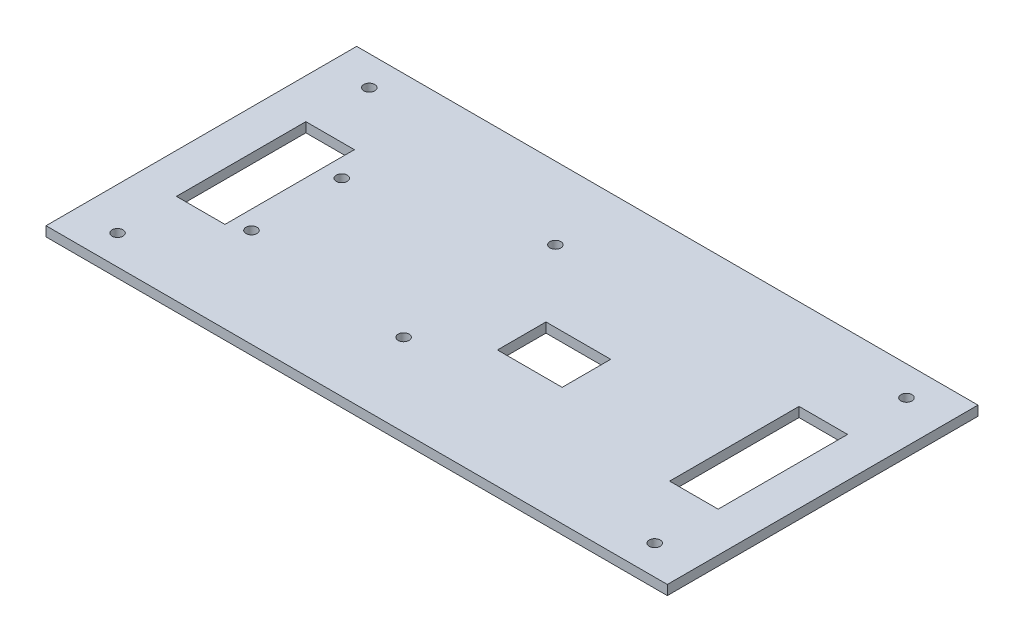
ISO-10303-21;
HEADER;
FILE_DESCRIPTION(('STEP AP214'),'2;1');
FILE_NAME('part.step','',(''),(''),'','','');
FILE_SCHEMA(('AUTOMOTIVE_DESIGN { 1 0 10303 214 1 1 1 1 }'));
ENDSEC;
DATA;
#1=APPLICATION_CONTEXT('core data for automotive mechanical design processes');
#2=APPLICATION_PROTOCOL_DEFINITION('international standard','automotive_design',2000,#1);
#3=PRODUCT_CONTEXT('',#1,'mechanical');
#4=PRODUCT('Part','Part','',(#3));
#5=PRODUCT_RELATED_PRODUCT_CATEGORY('part','',(#4));
#6=PRODUCT_DEFINITION_FORMATION('','',#4);
#7=PRODUCT_DEFINITION_CONTEXT('part definition',#1,'design');
#8=PRODUCT_DEFINITION('design','',#6,#7);
#9=PRODUCT_DEFINITION_SHAPE('','',#8);
#10=(LENGTH_UNIT() NAMED_UNIT(*) SI_UNIT(.MILLI.,.METRE.));
#11=(NAMED_UNIT(*) PLANE_ANGLE_UNIT() SI_UNIT($,.RADIAN.));
#12=(NAMED_UNIT(*) SI_UNIT($,.STERADIAN.) SOLID_ANGLE_UNIT());
#13=UNCERTAINTY_MEASURE_WITH_UNIT(LENGTH_MEASURE(1.E-05),#10,'distance_accuracy_value','');
#14=(GEOMETRIC_REPRESENTATION_CONTEXT(3) GLOBAL_UNCERTAINTY_ASSIGNED_CONTEXT((#13)) GLOBAL_UNIT_ASSIGNED_CONTEXT((#10,
#11,#12)) REPRESENTATION_CONTEXT('',''));
#15=CARTESIAN_POINT('',(0.,0.,0.));
#16=DIRECTION('',(0.,0.,1.));
#17=DIRECTION('',(1.,0.,0.));
#18=AXIS2_PLACEMENT_3D('',#15,#16,#17);
#19=CARTESIAN_POINT('',(0.,3.,0.));
#20=DIRECTION('',(1.,0.,0.));
#21=DIRECTION('',(0.,0.,-1.));
#22=AXIS2_PLACEMENT_3D('',#19,#20,#21);
#23=PLANE('',#22);
#24=DIRECTION('',(0.,0.,1.));
#25=VECTOR('',#24,1.);
#26=CARTESIAN_POINT('',(0.,0.,0.));
#27=LINE('',#26,#25);
#28=CARTESIAN_POINT('',(0.,0.,-96.));
#29=VERTEX_POINT('',#28);
#30=CARTESIAN_POINT('',(0.,0.,0.));
#31=VERTEX_POINT('',#30);
#32=EDGE_CURVE('E276',#29,#31,#27,.T.);
#33=ORIENTED_EDGE('',*,*,#32,.T.);
#34=DIRECTION('',(0.,-1.,0.));
#35=VECTOR('',#34,1.);
#36=CARTESIAN_POINT('',(0.,3.,0.));
#37=LINE('',#36,#35);
#38=CARTESIAN_POINT('',(0.,3.,0.));
#39=VERTEX_POINT('',#38);
#40=EDGE_CURVE('E11',#39,#31,#37,.T.);
#41=ORIENTED_EDGE('',*,*,#40,.F.);
#42=DIRECTION('',(0.,0.,1.));
#43=VECTOR('',#42,1.);
#44=CARTESIAN_POINT('',(0.,3.,0.));
#45=LINE('',#44,#43);
#46=CARTESIAN_POINT('',(0.,3.,-96.));
#47=VERTEX_POINT('',#46);
#48=EDGE_CURVE('E277',#47,#39,#45,.T.);
#49=ORIENTED_EDGE('',*,*,#48,.F.);
#50=DIRECTION('',(0.,-1.,0.));
#51=VECTOR('',#50,1.);
#52=CARTESIAN_POINT('',(0.,3.,-96.));
#53=LINE('',#52,#51);
#54=EDGE_CURVE('E287',#47,#29,#53,.T.);
#55=ORIENTED_EDGE('',*,*,#54,.T.);
#56=EDGE_LOOP('',(#33,#41,#49,#55));
#57=FACE_BOUND('',#56,.T.);
#58=ADVANCED_FACE('F35',(#57),#23,.F.);
#59=CARTESIAN_POINT('',(0.,3.,0.));
#60=DIRECTION('',(0.,0.,-1.));
#61=DIRECTION('',(-1.,0.,0.));
#62=AXIS2_PLACEMENT_3D('',#59,#60,#61);
#63=PLANE('',#62);
#64=DIRECTION('',(1.,0.,0.));
#65=VECTOR('',#64,1.);
#66=CARTESIAN_POINT('',(0.,0.,0.));
#67=LINE('',#66,#65);
#68=CARTESIAN_POINT('',(192.,0.,0.));
#69=VERTEX_POINT('',#68);
#70=EDGE_CURVE('E290',#31,#69,#67,.T.);
#71=ORIENTED_EDGE('',*,*,#70,.T.);
#72=DIRECTION('',(0.,-1.,0.));
#73=VECTOR('',#72,1.);
#74=CARTESIAN_POINT('',(192.,3.,0.));
#75=LINE('',#74,#73);
#76=CARTESIAN_POINT('',(192.,3.,0.));
#77=VERTEX_POINT('',#76);
#78=EDGE_CURVE('E42',#77,#69,#75,.T.);
#79=ORIENTED_EDGE('',*,*,#78,.F.);
#80=DIRECTION('',(1.,0.,0.));
#81=VECTOR('',#80,1.);
#82=CARTESIAN_POINT('',(0.,3.,0.));
#83=LINE('',#82,#81);
#84=EDGE_CURVE('E280',#39,#77,#83,.T.);
#85=ORIENTED_EDGE('',*,*,#84,.F.);
#86=ORIENTED_EDGE('',*,*,#40,.T.);
#87=EDGE_LOOP('',(#71,#79,#85,#86));
#88=FACE_BOUND('',#87,.T.);
#89=ADVANCED_FACE('F319',(#88),#63,.F.);
#90=CARTESIAN_POINT('',(192.,3.,0.));
#91=DIRECTION('',(-1.,0.,0.));
#92=DIRECTION('',(0.,0.,1.));
#93=AXIS2_PLACEMENT_3D('',#90,#91,#92);
#94=PLANE('',#93);
#95=DIRECTION('',(0.,0.,-1.));
#96=VECTOR('',#95,1.);
#97=CARTESIAN_POINT('',(192.,0.,0.));
#98=LINE('',#97,#96);
#99=CARTESIAN_POINT('',(192.,0.,-96.));
#100=VERTEX_POINT('',#99);
#101=EDGE_CURVE('E292',#69,#100,#98,.T.);
#102=ORIENTED_EDGE('',*,*,#101,.T.);
#103=DIRECTION('',(0.,-1.,0.));
#104=VECTOR('',#103,1.);
#105=CARTESIAN_POINT('',(192.,3.,-96.));
#106=LINE('',#105,#104);
#107=CARTESIAN_POINT('',(192.,3.,-96.));
#108=VERTEX_POINT('',#107);
#109=EDGE_CURVE('E297',#108,#100,#106,.T.);
#110=ORIENTED_EDGE('',*,*,#109,.F.);
#111=DIRECTION('',(0.,0.,-1.));
#112=VECTOR('',#111,1.);
#113=CARTESIAN_POINT('',(192.,3.,0.));
#114=LINE('',#113,#112);
#115=EDGE_CURVE('E283',#77,#108,#114,.T.);
#116=ORIENTED_EDGE('',*,*,#115,.F.);
#117=ORIENTED_EDGE('',*,*,#78,.T.);
#118=EDGE_LOOP('',(#102,#110,#116,#117));
#119=FACE_BOUND('',#118,.T.);
#120=ADVANCED_FACE('F304',(#119),#94,.F.);
#121=CARTESIAN_POINT('',(0.,3.,-96.));
#122=DIRECTION('',(0.,0.,1.));
#123=DIRECTION('',(1.,0.,0.));
#124=AXIS2_PLACEMENT_3D('',#121,#122,#123);
#125=PLANE('',#124);
#126=DIRECTION('',(-1.,0.,0.));
#127=VECTOR('',#126,1.);
#128=CARTESIAN_POINT('',(0.,0.,-96.));
#129=LINE('',#128,#127);
#130=EDGE_CURVE('E281',#100,#29,#129,.T.);
#131=ORIENTED_EDGE('',*,*,#130,.T.);
#132=ORIENTED_EDGE('',*,*,#54,.F.);
#133=DIRECTION('',(-1.,0.,0.));
#134=VECTOR('',#133,1.);
#135=CARTESIAN_POINT('',(0.,3.,-96.));
#136=LINE('',#135,#134);
#137=EDGE_CURVE('E285',#108,#47,#136,.T.);
#138=ORIENTED_EDGE('',*,*,#137,.F.);
#139=ORIENTED_EDGE('',*,*,#109,.T.);
#140=EDGE_LOOP('',(#131,#132,#138,#139));
#141=FACE_BOUND('',#140,.T.);
#142=ADVANCED_FACE('F313',(#141),#125,.F.);
#143=CARTESIAN_POINT('',(0.,3.,0.));
#144=DIRECTION('',(0.,-1.,0.));
#145=DIRECTION('',(0.,0.,-1.));
#146=AXIS2_PLACEMENT_3D('',#143,#144,#145);
#147=PLANE('',#146);
#148=CARTESIAN_POINT('',(33.,3.,-58.4));
#149=DIRECTION('',(0.,-1.,0.));
#150=DIRECTION('',(0.,0.,-1.));
#151=AXIS2_PLACEMENT_3D('',#148,#149,#150);
#152=CIRCLE('',#151,1.7);
#153=CARTESIAN_POINT('',(33.,3.,-60.1));
#154=VERTEX_POINT('',#153);
#155=EDGE_CURVE('E413',#154,#154,#152,.T.);
#156=ORIENTED_EDGE('',*,*,#155,.T.);
#157=EDGE_LOOP('',(#156));
#158=FACE_BOUND('',#157,.T.);
#159=CARTESIAN_POINT('',(33.,3.,-30.5));
#160=DIRECTION('',(0.,-1.,0.));
#161=DIRECTION('',(0.,0.,-1.));
#162=AXIS2_PLACEMENT_3D('',#159,#160,#161);
#163=CIRCLE('',#162,1.7);
#164=CARTESIAN_POINT('',(33.,3.,-32.2));
#165=VERTEX_POINT('',#164);
#166=EDGE_CURVE('E423',#165,#165,#163,.T.);
#167=ORIENTED_EDGE('',*,*,#166,.T.);
#168=EDGE_LOOP('',(#167));
#169=FACE_BOUND('',#168,.T.);
#170=CARTESIAN_POINT('',(85.11,3.,-25.4));
#171=DIRECTION('',(0.,-1.,0.));
#172=DIRECTION('',(0.,0.,-1.));
#173=AXIS2_PLACEMENT_3D('',#170,#171,#172);
#174=CIRCLE('',#173,1.69999999999999);
#175=CARTESIAN_POINT('',(85.11,3.,-27.1));
#176=VERTEX_POINT('',#175);
#177=EDGE_CURVE('E429',#176,#176,#174,.T.);
#178=ORIENTED_EDGE('',*,*,#177,.T.);
#179=EDGE_LOOP('',(#178));
#180=FACE_BOUND('',#179,.T.);
#181=CARTESIAN_POINT('',(83.8,3.,-73.6));
#182=DIRECTION('',(0.,-1.,0.));
#183=DIRECTION('',(0.,0.,-1.));
#184=AXIS2_PLACEMENT_3D('',#181,#182,#183);
#185=CIRCLE('',#184,1.69999999999999);
#186=CARTESIAN_POINT('',(83.8,3.,-75.3));
#187=VERTEX_POINT('',#186);
#188=EDGE_CURVE('E175',#187,#187,#185,.T.);
#189=ORIENTED_EDGE('',*,*,#188,.T.);
#190=EDGE_LOOP('',(#189));
#191=FACE_BOUND('',#190,.T.);
#192=DIRECTION('',(1.,0.,0.));
#193=VECTOR('',#192,1.);
#194=CARTESIAN_POINT('',(179.7,3.,-68.0000000000001));
#195=LINE('',#194,#193);
#196=CARTESIAN_POINT('',(164.7,3.,-68.0000000000001));
#197=VERTEX_POINT('',#196);
#198=CARTESIAN_POINT('',(179.7,3.,-68.0000000000001));
#199=VERTEX_POINT('',#198);
#200=EDGE_CURVE('E159',#197,#199,#195,.T.);
#201=ORIENTED_EDGE('',*,*,#200,.T.);
#202=DIRECTION('',(0.,0.,1.));
#203=VECTOR('',#202,1.);
#204=CARTESIAN_POINT('',(179.7,3.,-28.));
#205=LINE('',#204,#203);
#206=CARTESIAN_POINT('',(179.7,3.,-28.));
#207=VERTEX_POINT('',#206);
#208=EDGE_CURVE('E151',#199,#207,#205,.T.);
#209=ORIENTED_EDGE('',*,*,#208,.T.);
#210=DIRECTION('',(-1.,0.,0.));
#211=VECTOR('',#210,1.);
#212=CARTESIAN_POINT('',(179.7,3.,-28.));
#213=LINE('',#212,#211);
#214=CARTESIAN_POINT('',(164.7,3.,-28.));
#215=VERTEX_POINT('',#214);
#216=EDGE_CURVE('E162',#207,#215,#213,.T.);
#217=ORIENTED_EDGE('',*,*,#216,.T.);
#218=DIRECTION('',(0.,0.,-1.));
#219=VECTOR('',#218,1.);
#220=CARTESIAN_POINT('',(164.7,3.,-28.));
#221=LINE('',#220,#219);
#222=EDGE_CURVE('E49',#215,#197,#221,.T.);
#223=ORIENTED_EDGE('',*,*,#222,.T.);
#224=EDGE_LOOP('',(#201,#209,#217,#223));
#225=FACE_BOUND('',#224,.T.);
#226=DIRECTION('',(-1.,0.,0.));
#227=VECTOR('',#226,1.);
#228=CARTESIAN_POINT('',(103.,3.,-36.5));
#229=LINE('',#228,#227);
#230=CARTESIAN_POINT('',(123.,3.,-36.5));
#231=VERTEX_POINT('',#230);
#232=CARTESIAN_POINT('',(103.,3.,-36.5));
#233=VERTEX_POINT('',#232);
#234=EDGE_CURVE('E200',#231,#233,#229,.T.);
#235=ORIENTED_EDGE('',*,*,#234,.T.);
#236=DIRECTION('',(0.,0.,-1.));
#237=VECTOR('',#236,1.);
#238=CARTESIAN_POINT('',(103.,3.,-36.5));
#239=LINE('',#238,#237);
#240=CARTESIAN_POINT('',(103.,3.,-51.5));
#241=VERTEX_POINT('',#240);
#242=EDGE_CURVE('E192',#233,#241,#239,.T.);
#243=ORIENTED_EDGE('',*,*,#242,.T.);
#244=DIRECTION('',(1.,0.,0.));
#245=VECTOR('',#244,1.);
#246=CARTESIAN_POINT('',(103.,3.,-51.5));
#247=LINE('',#246,#245);
#248=CARTESIAN_POINT('',(123.,3.,-51.5));
#249=VERTEX_POINT('',#248);
#250=EDGE_CURVE('E195',#241,#249,#247,.T.);
#251=ORIENTED_EDGE('',*,*,#250,.T.);
#252=DIRECTION('',(0.,0.,1.));
#253=VECTOR('',#252,1.);
#254=CARTESIAN_POINT('',(123.,3.,-36.5));
#255=LINE('',#254,#253);
#256=EDGE_CURVE('E57',#249,#231,#255,.T.);
#257=ORIENTED_EDGE('',*,*,#256,.T.);
#258=EDGE_LOOP('',(#235,#243,#251,#257));
#259=FACE_BOUND('',#258,.T.);
#260=DIRECTION('',(-1.,0.,0.));
#261=VECTOR('',#260,1.);
#262=CARTESIAN_POINT('',(12.3,3.,-28.));
#263=LINE('',#262,#261);
#264=CARTESIAN_POINT('',(27.3,3.,-28.));
#265=VERTEX_POINT('',#264);
#266=CARTESIAN_POINT('',(12.3,3.,-28.));
#267=VERTEX_POINT('',#266);
#268=EDGE_CURVE('E231',#265,#267,#263,.T.);
#269=ORIENTED_EDGE('',*,*,#268,.T.);
#270=DIRECTION('',(0.,0.,-1.));
#271=VECTOR('',#270,1.);
#272=CARTESIAN_POINT('',(12.3,3.,-28.));
#273=LINE('',#272,#271);
#274=CARTESIAN_POINT('',(12.3,3.,-68.));
#275=VERTEX_POINT('',#274);
#276=EDGE_CURVE('E221',#267,#275,#273,.T.);
#277=ORIENTED_EDGE('',*,*,#276,.T.);
#278=DIRECTION('',(1.,0.,0.));
#279=VECTOR('',#278,1.);
#280=CARTESIAN_POINT('',(12.3,3.,-68.));
#281=LINE('',#280,#279);
#282=CARTESIAN_POINT('',(27.3,3.,-68.));
#283=VERTEX_POINT('',#282);
#284=EDGE_CURVE('E224',#275,#283,#281,.T.);
#285=ORIENTED_EDGE('',*,*,#284,.T.);
#286=DIRECTION('',(0.,0.,1.));
#287=VECTOR('',#286,1.);
#288=CARTESIAN_POINT('',(27.3,3.,-28.));
#289=LINE('',#288,#287);
#290=EDGE_CURVE('E228',#283,#265,#289,.T.);
#291=ORIENTED_EDGE('',*,*,#290,.T.);
#292=EDGE_LOOP('',(#269,#277,#285,#291));
#293=FACE_BOUND('',#292,.T.);
#294=CARTESIAN_POINT('',(13.,3.,-9.1));
#295=DIRECTION('',(0.,-1.,0.));
#296=DIRECTION('',(0.,0.,-1.));
#297=AXIS2_PLACEMENT_3D('',#294,#295,#296);
#298=CIRCLE('',#297,1.7);
#299=CARTESIAN_POINT('',(13.,3.,-10.8));
#300=VERTEX_POINT('',#299);
#301=EDGE_CURVE('E255',#300,#300,#298,.T.);
#302=ORIENTED_EDGE('',*,*,#301,.T.);
#303=EDGE_LOOP('',(#302));
#304=FACE_BOUND('',#303,.T.);
#305=CARTESIAN_POINT('',(179.,3.,-9.1));
#306=DIRECTION('',(0.,-1.,0.));
#307=DIRECTION('',(0.,0.,-1.));
#308=AXIS2_PLACEMENT_3D('',#305,#306,#307);
#309=CIRCLE('',#308,1.70000000000001);
#310=CARTESIAN_POINT('',(179.,3.,-10.8));
#311=VERTEX_POINT('',#310);
#312=EDGE_CURVE('E261',#311,#311,#309,.T.);
#313=ORIENTED_EDGE('',*,*,#312,.T.);
#314=EDGE_LOOP('',(#313));
#315=FACE_BOUND('',#314,.T.);
#316=CARTESIAN_POINT('',(179.,3.,-86.9));
#317=DIRECTION('',(0.,-1.,0.));
#318=DIRECTION('',(0.,0.,-1.));
#319=AXIS2_PLACEMENT_3D('',#316,#317,#318);
#320=CIRCLE('',#319,1.70000000000001);
#321=CARTESIAN_POINT('',(179.,3.,-88.6));
#322=VERTEX_POINT('',#321);
#323=EDGE_CURVE('E267',#322,#322,#320,.T.);
#324=ORIENTED_EDGE('',*,*,#323,.T.);
#325=EDGE_LOOP('',(#324));
#326=FACE_BOUND('',#325,.T.);
#327=CARTESIAN_POINT('',(13.,3.,-86.9));
#328=DIRECTION('',(0.,-1.,0.));
#329=DIRECTION('',(0.,0.,-1.));
#330=AXIS2_PLACEMENT_3D('',#327,#328,#329);
#331=CIRCLE('',#330,1.7);
#332=CARTESIAN_POINT('',(13.,3.,-88.6));
#333=VERTEX_POINT('',#332);
#334=EDGE_CURVE('E273',#333,#333,#331,.T.);
#335=ORIENTED_EDGE('',*,*,#334,.T.);
#336=EDGE_LOOP('',(#335));
#337=FACE_BOUND('',#336,.T.);
#338=ORIENTED_EDGE('',*,*,#48,.T.);
#339=ORIENTED_EDGE('',*,*,#84,.T.);
#340=ORIENTED_EDGE('',*,*,#115,.T.);
#341=ORIENTED_EDGE('',*,*,#137,.T.);
#342=EDGE_LOOP('',(#338,#339,#340,#341));
#343=FACE_BOUND('',#342,.T.);
#344=ADVANCED_FACE('F166',(#158,#169,#180,#191,#225,#259,#293,#304,#315,#326,#337,#343),#147,.F.);
#345=CARTESIAN_POINT('',(0.,0.,0.));
#346=DIRECTION('',(0.,-1.,0.));
#347=DIRECTION('',(0.,0.,-1.));
#348=AXIS2_PLACEMENT_3D('',#345,#346,#347);
#349=PLANE('',#348);
#350=CARTESIAN_POINT('',(33.,0.,-58.4));
#351=DIRECTION('',(0.,-1.,0.));
#352=DIRECTION('',(0.,0.,-1.));
#353=AXIS2_PLACEMENT_3D('',#350,#351,#352);
#354=CIRCLE('',#353,1.69999999999999);
#355=CARTESIAN_POINT('',(33.,0.,-60.1));
#356=VERTEX_POINT('',#355);
#357=EDGE_CURVE('E416',#356,#356,#354,.T.);
#358=ORIENTED_EDGE('',*,*,#357,.F.);
#359=EDGE_LOOP('',(#358));
#360=FACE_BOUND('',#359,.T.);
#361=CARTESIAN_POINT('',(33.,0.,-30.5));
#362=DIRECTION('',(0.,-1.,0.));
#363=DIRECTION('',(0.,0.,-1.));
#364=AXIS2_PLACEMENT_3D('',#361,#362,#363);
#365=CIRCLE('',#364,1.69999999999999);
#366=CARTESIAN_POINT('',(33.,0.,-32.2));
#367=VERTEX_POINT('',#366);
#368=EDGE_CURVE('E418',#367,#367,#365,.T.);
#369=ORIENTED_EDGE('',*,*,#368,.F.);
#370=EDGE_LOOP('',(#369));
#371=FACE_BOUND('',#370,.T.);
#372=CARTESIAN_POINT('',(85.11,0.,-25.4));
#373=DIRECTION('',(0.,-1.,0.));
#374=DIRECTION('',(0.,0.,-1.));
#375=AXIS2_PLACEMENT_3D('',#372,#373,#374);
#376=CIRCLE('',#375,1.69999999999999);
#377=CARTESIAN_POINT('',(85.11,0.,-27.1));
#378=VERTEX_POINT('',#377);
#379=EDGE_CURVE('E426',#378,#378,#376,.T.);
#380=ORIENTED_EDGE('',*,*,#379,.F.);
#381=EDGE_LOOP('',(#380));
#382=FACE_BOUND('',#381,.T.);
#383=CARTESIAN_POINT('',(83.8,0.,-73.6));
#384=DIRECTION('',(0.,-1.,0.));
#385=DIRECTION('',(0.,0.,-1.));
#386=AXIS2_PLACEMENT_3D('',#383,#384,#385);
#387=CIRCLE('',#386,1.69999999999999);
#388=CARTESIAN_POINT('',(83.8,0.,-75.3));
#389=VERTEX_POINT('',#388);
#390=EDGE_CURVE('E431',#389,#389,#387,.T.);
#391=ORIENTED_EDGE('',*,*,#390,.F.);
#392=EDGE_LOOP('',(#391));
#393=FACE_BOUND('',#392,.T.);
#394=DIRECTION('',(0.,0.,1.));
#395=VECTOR('',#394,1.);
#396=CARTESIAN_POINT('',(179.7,0.,-28.));
#397=LINE('',#396,#395);
#398=CARTESIAN_POINT('',(179.7,0.,-68.0000000000001));
#399=VERTEX_POINT('',#398);
#400=CARTESIAN_POINT('',(179.7,0.,-28.));
#401=VERTEX_POINT('',#400);
#402=EDGE_CURVE('E154',#399,#401,#397,.T.);
#403=ORIENTED_EDGE('',*,*,#402,.F.);
#404=DIRECTION('',(1.,0.,0.));
#405=VECTOR('',#404,1.);
#406=CARTESIAN_POINT('',(179.7,0.,-68.0000000000001));
#407=LINE('',#406,#405);
#408=CARTESIAN_POINT('',(164.7,0.,-68.0000000000001));
#409=VERTEX_POINT('',#408);
#410=EDGE_CURVE('E169',#409,#399,#407,.T.);
#411=ORIENTED_EDGE('',*,*,#410,.F.);
#412=DIRECTION('',(0.,0.,-1.));
#413=VECTOR('',#412,1.);
#414=CARTESIAN_POINT('',(164.7,0.,-28.));
#415=LINE('',#414,#413);
#416=CARTESIAN_POINT('',(164.7,0.,-28.));
#417=VERTEX_POINT('',#416);
#418=EDGE_CURVE('E172',#417,#409,#415,.T.);
#419=ORIENTED_EDGE('',*,*,#418,.F.);
#420=DIRECTION('',(-1.,0.,0.));
#421=VECTOR('',#420,1.);
#422=CARTESIAN_POINT('',(179.7,0.,-28.));
#423=LINE('',#422,#421);
#424=EDGE_CURVE('E181',#401,#417,#423,.T.);
#425=ORIENTED_EDGE('',*,*,#424,.F.);
#426=EDGE_LOOP('',(#403,#411,#419,#425));
#427=FACE_BOUND('',#426,.T.);
#428=DIRECTION('',(0.,0.,-1.));
#429=VECTOR('',#428,1.);
#430=CARTESIAN_POINT('',(103.,0.,-36.5));
#431=LINE('',#430,#429);
#432=CARTESIAN_POINT('',(103.,0.,-36.5));
#433=VERTEX_POINT('',#432);
#434=CARTESIAN_POINT('',(103.,0.,-51.5));
#435=VERTEX_POINT('',#434);
#436=EDGE_CURVE('E204',#433,#435,#431,.T.);
#437=ORIENTED_EDGE('',*,*,#436,.F.);
#438=DIRECTION('',(-1.,0.,0.));
#439=VECTOR('',#438,1.);
#440=CARTESIAN_POINT('',(103.,0.,-36.5));
#441=LINE('',#440,#439);
#442=CARTESIAN_POINT('',(123.,0.,-36.5));
#443=VERTEX_POINT('',#442);
#444=EDGE_CURVE('E196',#443,#433,#441,.T.);
#445=ORIENTED_EDGE('',*,*,#444,.F.);
#446=DIRECTION('',(0.,0.,1.));
#447=VECTOR('',#446,1.);
#448=CARTESIAN_POINT('',(123.,0.,-36.5));
#449=LINE('',#448,#447);
#450=CARTESIAN_POINT('',(123.,0.,-51.5));
#451=VERTEX_POINT('',#450);
#452=EDGE_CURVE('E209',#451,#443,#449,.T.);
#453=ORIENTED_EDGE('',*,*,#452,.F.);
#454=DIRECTION('',(1.,0.,0.));
#455=VECTOR('',#454,1.);
#456=CARTESIAN_POINT('',(103.,0.,-51.5));
#457=LINE('',#456,#455);
#458=EDGE_CURVE('E206',#435,#451,#457,.T.);
#459=ORIENTED_EDGE('',*,*,#458,.F.);
#460=EDGE_LOOP('',(#437,#445,#453,#459));
#461=FACE_BOUND('',#460,.T.);
#462=DIRECTION('',(0.,0.,-1.));
#463=VECTOR('',#462,1.);
#464=CARTESIAN_POINT('',(12.3,0.,-28.));
#465=LINE('',#464,#463);
#466=CARTESIAN_POINT('',(12.3,0.,-28.));
#467=VERTEX_POINT('',#466);
#468=CARTESIAN_POINT('',(12.3,0.,-68.));
#469=VERTEX_POINT('',#468);
#470=EDGE_CURVE('E188',#467,#469,#465,.T.);
#471=ORIENTED_EDGE('',*,*,#470,.F.);
#472=DIRECTION('',(-1.,0.,0.));
#473=VECTOR('',#472,1.);
#474=CARTESIAN_POINT('',(12.3,0.,-28.));
#475=LINE('',#474,#473);
#476=CARTESIAN_POINT('',(27.3,0.,-28.));
#477=VERTEX_POINT('',#476);
#478=EDGE_CURVE('E225',#477,#467,#475,.T.);
#479=ORIENTED_EDGE('',*,*,#478,.F.);
#480=DIRECTION('',(0.,0.,1.));
#481=VECTOR('',#480,1.);
#482=CARTESIAN_POINT('',(27.3,0.,-28.));
#483=LINE('',#482,#481);
#484=CARTESIAN_POINT('',(27.3,0.,-68.));
#485=VERTEX_POINT('',#484);
#486=EDGE_CURVE('E239',#485,#477,#483,.T.);
#487=ORIENTED_EDGE('',*,*,#486,.F.);
#488=DIRECTION('',(1.,0.,0.));
#489=VECTOR('',#488,1.);
#490=CARTESIAN_POINT('',(12.3,0.,-68.));
#491=LINE('',#490,#489);
#492=EDGE_CURVE('E236',#469,#485,#491,.T.);
#493=ORIENTED_EDGE('',*,*,#492,.F.);
#494=EDGE_LOOP('',(#471,#479,#487,#493));
#495=FACE_BOUND('',#494,.T.);
#496=CARTESIAN_POINT('',(13.,0.,-9.1));
#497=DIRECTION('',(0.,-1.,0.));
#498=DIRECTION('',(0.,0.,-1.));
#499=AXIS2_PLACEMENT_3D('',#496,#497,#498);
#500=CIRCLE('',#499,1.69999999999999);
#501=CARTESIAN_POINT('',(13.,0.,-10.8));
#502=VERTEX_POINT('',#501);
#503=EDGE_CURVE('E246',#502,#502,#500,.T.);
#504=ORIENTED_EDGE('',*,*,#503,.F.);
#505=EDGE_LOOP('',(#504));
#506=FACE_BOUND('',#505,.T.);
#507=CARTESIAN_POINT('',(179.,0.,-9.1));
#508=DIRECTION('',(0.,-1.,0.));
#509=DIRECTION('',(0.,0.,-1.));
#510=AXIS2_PLACEMENT_3D('',#507,#508,#509);
#511=CIRCLE('',#510,1.69999999999998);
#512=CARTESIAN_POINT('',(179.,0.,-10.8));
#513=VERTEX_POINT('',#512);
#514=EDGE_CURVE('E258',#513,#513,#511,.T.);
#515=ORIENTED_EDGE('',*,*,#514,.F.);
#516=EDGE_LOOP('',(#515));
#517=FACE_BOUND('',#516,.T.);
#518=CARTESIAN_POINT('',(179.,0.,-86.9));
#519=DIRECTION('',(0.,-1.,0.));
#520=DIRECTION('',(0.,0.,-1.));
#521=AXIS2_PLACEMENT_3D('',#518,#519,#520);
#522=CIRCLE('',#521,1.69999999999998);
#523=CARTESIAN_POINT('',(179.,0.,-88.6));
#524=VERTEX_POINT('',#523);
#525=EDGE_CURVE('E264',#524,#524,#522,.T.);
#526=ORIENTED_EDGE('',*,*,#525,.F.);
#527=EDGE_LOOP('',(#526));
#528=FACE_BOUND('',#527,.T.);
#529=CARTESIAN_POINT('',(13.,0.,-86.9));
#530=DIRECTION('',(0.,-1.,0.));
#531=DIRECTION('',(0.,0.,-1.));
#532=AXIS2_PLACEMENT_3D('',#529,#530,#531);
#533=CIRCLE('',#532,1.69999999999999);
#534=CARTESIAN_POINT('',(13.,0.,-88.6));
#535=VERTEX_POINT('',#534);
#536=EDGE_CURVE('E270',#535,#535,#533,.T.);
#537=ORIENTED_EDGE('',*,*,#536,.F.);
#538=EDGE_LOOP('',(#537));
#539=FACE_BOUND('',#538,.T.);
#540=ORIENTED_EDGE('',*,*,#32,.F.);
#541=ORIENTED_EDGE('',*,*,#130,.F.);
#542=ORIENTED_EDGE('',*,*,#101,.F.);
#543=ORIENTED_EDGE('',*,*,#70,.F.);
#544=EDGE_LOOP('',(#540,#541,#542,#543));
#545=FACE_BOUND('',#544,.T.);
#546=ADVANCED_FACE('F310',(#360,#371,#382,#393,#427,#461,#495,#506,#517,#528,#539,#545),#349,.T.);
#547=CARTESIAN_POINT('',(13.,0.,-86.9));
#548=DIRECTION('',(0.,-1.,0.));
#549=DIRECTION('',(0.,0.,-1.));
#550=AXIS2_PLACEMENT_3D('',#547,#548,#549);
#551=CYLINDRICAL_SURFACE('',#550,1.69999999999999);
#552=ORIENTED_EDGE('',*,*,#334,.F.);
#553=EDGE_LOOP('',(#552));
#554=FACE_BOUND('',#553,.T.);
#555=ORIENTED_EDGE('',*,*,#536,.T.);
#556=EDGE_LOOP('',(#555));
#557=FACE_BOUND('',#556,.T.);
#558=ADVANCED_FACE('F331',(#554,#557),#551,.F.);
#559=CARTESIAN_POINT('',(179.,0.,-86.9));
#560=DIRECTION('',(0.,-1.,0.));
#561=DIRECTION('',(0.,0.,-1.));
#562=AXIS2_PLACEMENT_3D('',#559,#560,#561);
#563=CYLINDRICAL_SURFACE('',#562,1.69999999999999);
#564=ORIENTED_EDGE('',*,*,#323,.F.);
#565=EDGE_LOOP('',(#564));
#566=FACE_BOUND('',#565,.T.);
#567=ORIENTED_EDGE('',*,*,#525,.T.);
#568=EDGE_LOOP('',(#567));
#569=FACE_BOUND('',#568,.T.);
#570=ADVANCED_FACE('F338',(#566,#569),#563,.F.);
#571=CARTESIAN_POINT('',(179.,0.,-9.1));
#572=DIRECTION('',(0.,-1.,0.));
#573=DIRECTION('',(0.,0.,-1.));
#574=AXIS2_PLACEMENT_3D('',#571,#572,#573);
#575=CYLINDRICAL_SURFACE('',#574,1.69999999999999);
#576=ORIENTED_EDGE('',*,*,#312,.F.);
#577=EDGE_LOOP('',(#576));
#578=FACE_BOUND('',#577,.T.);
#579=ORIENTED_EDGE('',*,*,#514,.T.);
#580=EDGE_LOOP('',(#579));
#581=FACE_BOUND('',#580,.T.);
#582=ADVANCED_FACE('F342',(#578,#581),#575,.F.);
#583=CARTESIAN_POINT('',(13.,0.,-9.1));
#584=DIRECTION('',(0.,-1.,0.));
#585=DIRECTION('',(0.,0.,-1.));
#586=AXIS2_PLACEMENT_3D('',#583,#584,#585);
#587=CYLINDRICAL_SURFACE('',#586,1.69999999999999);
#588=ORIENTED_EDGE('',*,*,#301,.F.);
#589=EDGE_LOOP('',(#588));
#590=FACE_BOUND('',#589,.T.);
#591=ORIENTED_EDGE('',*,*,#503,.T.);
#592=EDGE_LOOP('',(#591));
#593=FACE_BOUND('',#592,.T.);
#594=ADVANCED_FACE('F346',(#590,#593),#587,.F.);
#595=CARTESIAN_POINT('',(12.3,3.,-28.));
#596=DIRECTION('',(-1.,0.,0.));
#597=DIRECTION('',(0.,0.,1.));
#598=AXIS2_PLACEMENT_3D('',#595,#596,#597);
#599=PLANE('',#598);
#600=ORIENTED_EDGE('',*,*,#470,.T.);
#601=DIRECTION('',(0.,-1.,0.));
#602=VECTOR('',#601,1.);
#603=CARTESIAN_POINT('',(12.3,3.,-68.));
#604=LINE('',#603,#602);
#605=EDGE_CURVE('E234',#275,#469,#604,.T.);
#606=ORIENTED_EDGE('',*,*,#605,.F.);
#607=ORIENTED_EDGE('',*,*,#276,.F.);
#608=DIRECTION('',(0.,-1.,0.));
#609=VECTOR('',#608,1.);
#610=CARTESIAN_POINT('',(12.3,3.,-28.));
#611=LINE('',#610,#609);
#612=EDGE_CURVE('E244',#267,#467,#611,.T.);
#613=ORIENTED_EDGE('',*,*,#612,.T.);
#614=EDGE_LOOP('',(#600,#606,#607,#613));
#615=FACE_BOUND('',#614,.T.);
#616=ADVANCED_FACE('F350',(#615),#599,.F.);
#617=CARTESIAN_POINT('',(12.3,3.,-28.));
#618=DIRECTION('',(0.,0.,1.));
#619=DIRECTION('',(1.,0.,0.));
#620=AXIS2_PLACEMENT_3D('',#617,#618,#619);
#621=PLANE('',#620);
#622=ORIENTED_EDGE('',*,*,#478,.T.);
#623=ORIENTED_EDGE('',*,*,#612,.F.);
#624=ORIENTED_EDGE('',*,*,#268,.F.);
#625=DIRECTION('',(0.,-1.,0.));
#626=VECTOR('',#625,1.);
#627=CARTESIAN_POINT('',(27.3,3.,-28.));
#628=LINE('',#627,#626);
#629=EDGE_CURVE('E247',#265,#477,#628,.T.);
#630=ORIENTED_EDGE('',*,*,#629,.T.);
#631=EDGE_LOOP('',(#622,#623,#624,#630));
#632=FACE_BOUND('',#631,.T.);
#633=ADVANCED_FACE('F354',(#632),#621,.F.);
#634=CARTESIAN_POINT('',(27.3,3.,-28.));
#635=DIRECTION('',(1.,0.,0.));
#636=DIRECTION('',(0.,0.,-1.));
#637=AXIS2_PLACEMENT_3D('',#634,#635,#636);
#638=PLANE('',#637);
#639=ORIENTED_EDGE('',*,*,#486,.T.);
#640=ORIENTED_EDGE('',*,*,#629,.F.);
#641=ORIENTED_EDGE('',*,*,#290,.F.);
#642=DIRECTION('',(0.,-1.,0.));
#643=VECTOR('',#642,1.);
#644=CARTESIAN_POINT('',(27.3,3.,-68.));
#645=LINE('',#644,#643);
#646=EDGE_CURVE('E249',#283,#485,#645,.T.);
#647=ORIENTED_EDGE('',*,*,#646,.T.);
#648=EDGE_LOOP('',(#639,#640,#641,#647));
#649=FACE_BOUND('',#648,.T.);
#650=ADVANCED_FACE('F360',(#649),#638,.F.);
#651=CARTESIAN_POINT('',(12.3,3.,-68.));
#652=DIRECTION('',(0.,0.,-1.));
#653=DIRECTION('',(-1.,0.,0.));
#654=AXIS2_PLACEMENT_3D('',#651,#652,#653);
#655=PLANE('',#654);
#656=ORIENTED_EDGE('',*,*,#492,.T.);
#657=ORIENTED_EDGE('',*,*,#646,.F.);
#658=ORIENTED_EDGE('',*,*,#284,.F.);
#659=ORIENTED_EDGE('',*,*,#605,.T.);
#660=EDGE_LOOP('',(#656,#657,#658,#659));
#661=FACE_BOUND('',#660,.T.);
#662=ADVANCED_FACE('F356',(#661),#655,.F.);
#663=CARTESIAN_POINT('',(103.,3.,-36.5));
#664=DIRECTION('',(-1.,0.,0.));
#665=DIRECTION('',(0.,0.,1.));
#666=AXIS2_PLACEMENT_3D('',#663,#664,#665);
#667=PLANE('',#666);
#668=ORIENTED_EDGE('',*,*,#436,.T.);
#669=DIRECTION('',(0.,-1.,0.));
#670=VECTOR('',#669,1.);
#671=CARTESIAN_POINT('',(103.,3.,-51.5));
#672=LINE('',#671,#670);
#673=EDGE_CURVE('E203',#241,#435,#672,.T.);
#674=ORIENTED_EDGE('',*,*,#673,.F.);
#675=ORIENTED_EDGE('',*,*,#242,.F.);
#676=DIRECTION('',(0.,-1.,0.));
#677=VECTOR('',#676,1.);
#678=CARTESIAN_POINT('',(103.,3.,-36.5));
#679=LINE('',#678,#677);
#680=EDGE_CURVE('E182',#233,#433,#679,.T.);
#681=ORIENTED_EDGE('',*,*,#680,.T.);
#682=EDGE_LOOP('',(#668,#674,#675,#681));
#683=FACE_BOUND('',#682,.T.);
#684=ADVANCED_FACE('F359',(#683),#667,.F.);
#685=CARTESIAN_POINT('',(103.,3.,-36.5));
#686=DIRECTION('',(0.,0.,1.));
#687=DIRECTION('',(1.,0.,0.));
#688=AXIS2_PLACEMENT_3D('',#685,#686,#687);
#689=PLANE('',#688);
#690=ORIENTED_EDGE('',*,*,#444,.T.);
#691=ORIENTED_EDGE('',*,*,#680,.F.);
#692=ORIENTED_EDGE('',*,*,#234,.F.);
#693=DIRECTION('',(0.,-1.,0.));
#694=VECTOR('',#693,1.);
#695=CARTESIAN_POINT('',(123.,3.,-36.5));
#696=LINE('',#695,#694);
#697=EDGE_CURVE('E215',#231,#443,#696,.T.);
#698=ORIENTED_EDGE('',*,*,#697,.T.);
#699=EDGE_LOOP('',(#690,#691,#692,#698));
#700=FACE_BOUND('',#699,.T.);
#701=ADVANCED_FACE('F370',(#700),#689,.F.);
#702=CARTESIAN_POINT('',(123.,3.,-36.5));
#703=DIRECTION('',(1.,0.,0.));
#704=DIRECTION('',(0.,0.,-1.));
#705=AXIS2_PLACEMENT_3D('',#702,#703,#704);
#706=PLANE('',#705);
#707=ORIENTED_EDGE('',*,*,#452,.T.);
#708=ORIENTED_EDGE('',*,*,#697,.F.);
#709=ORIENTED_EDGE('',*,*,#256,.F.);
#710=DIRECTION('',(0.,-1.,0.));
#711=VECTOR('',#710,1.);
#712=CARTESIAN_POINT('',(123.,3.,-51.5));
#713=LINE('',#712,#711);
#714=EDGE_CURVE('E217',#249,#451,#713,.T.);
#715=ORIENTED_EDGE('',*,*,#714,.T.);
#716=EDGE_LOOP('',(#707,#708,#709,#715));
#717=FACE_BOUND('',#716,.T.);
#718=ADVANCED_FACE('F375',(#717),#706,.F.);
#719=CARTESIAN_POINT('',(103.,3.,-51.5));
#720=DIRECTION('',(0.,0.,-1.));
#721=DIRECTION('',(-1.,0.,0.));
#722=AXIS2_PLACEMENT_3D('',#719,#720,#721);
#723=PLANE('',#722);
#724=ORIENTED_EDGE('',*,*,#458,.T.);
#725=ORIENTED_EDGE('',*,*,#714,.F.);
#726=ORIENTED_EDGE('',*,*,#250,.F.);
#727=ORIENTED_EDGE('',*,*,#673,.T.);
#728=EDGE_LOOP('',(#724,#725,#726,#727));
#729=FACE_BOUND('',#728,.T.);
#730=ADVANCED_FACE('F372',(#729),#723,.F.);
#731=CARTESIAN_POINT('',(179.7,3.,-28.));
#732=DIRECTION('',(1.,0.,0.));
#733=DIRECTION('',(0.,0.,-1.));
#734=AXIS2_PLACEMENT_3D('',#731,#732,#733);
#735=PLANE('',#734);
#736=ORIENTED_EDGE('',*,*,#402,.T.);
#737=DIRECTION('',(0.,-1.,0.));
#738=VECTOR('',#737,1.);
#739=CARTESIAN_POINT('',(179.7,3.,-28.));
#740=LINE('',#739,#738);
#741=EDGE_CURVE('E147',#207,#401,#740,.T.);
#742=ORIENTED_EDGE('',*,*,#741,.F.);
#743=ORIENTED_EDGE('',*,*,#208,.F.);
#744=DIRECTION('',(0.,-1.,0.));
#745=VECTOR('',#744,1.);
#746=CARTESIAN_POINT('',(179.7,3.,-68.0000000000001));
#747=LINE('',#746,#745);
#748=EDGE_CURVE('E186',#199,#399,#747,.T.);
#749=ORIENTED_EDGE('',*,*,#748,.T.);
#750=EDGE_LOOP('',(#736,#742,#743,#749));
#751=FACE_BOUND('',#750,.T.);
#752=ADVANCED_FACE('F149',(#751),#735,.F.);
#753=CARTESIAN_POINT('',(179.7,3.,-68.0000000000001));
#754=DIRECTION('',(0.,0.,-1.));
#755=DIRECTION('',(-1.,0.,0.));
#756=AXIS2_PLACEMENT_3D('',#753,#754,#755);
#757=PLANE('',#756);
#758=ORIENTED_EDGE('',*,*,#410,.T.);
#759=ORIENTED_EDGE('',*,*,#748,.F.);
#760=ORIENTED_EDGE('',*,*,#200,.F.);
#761=DIRECTION('',(0.,-1.,0.));
#762=VECTOR('',#761,1.);
#763=CARTESIAN_POINT('',(164.7,3.,-68.0000000000001));
#764=LINE('',#763,#762);
#765=EDGE_CURVE('E189',#197,#409,#764,.T.);
#766=ORIENTED_EDGE('',*,*,#765,.T.);
#767=EDGE_LOOP('',(#758,#759,#760,#766));
#768=FACE_BOUND('',#767,.T.);
#769=ADVANCED_FACE('F384',(#768),#757,.F.);
#770=CARTESIAN_POINT('',(164.7,3.,-28.));
#771=DIRECTION('',(-1.,0.,0.));
#772=DIRECTION('',(0.,0.,1.));
#773=AXIS2_PLACEMENT_3D('',#770,#771,#772);
#774=PLANE('',#773);
#775=ORIENTED_EDGE('',*,*,#418,.T.);
#776=ORIENTED_EDGE('',*,*,#765,.F.);
#777=ORIENTED_EDGE('',*,*,#222,.F.);
#778=DIRECTION('',(0.,-1.,0.));
#779=VECTOR('',#778,1.);
#780=CARTESIAN_POINT('',(164.7,3.,-28.));
#781=LINE('',#780,#779);
#782=EDGE_CURVE('E158',#215,#417,#781,.T.);
#783=ORIENTED_EDGE('',*,*,#782,.T.);
#784=EDGE_LOOP('',(#775,#776,#777,#783));
#785=FACE_BOUND('',#784,.T.);
#786=ADVANCED_FACE('F388',(#785),#774,.F.);
#787=CARTESIAN_POINT('',(179.7,3.,-28.));
#788=DIRECTION('',(0.,0.,1.));
#789=DIRECTION('',(1.,0.,0.));
#790=AXIS2_PLACEMENT_3D('',#787,#788,#789);
#791=PLANE('',#790);
#792=ORIENTED_EDGE('',*,*,#424,.T.);
#793=ORIENTED_EDGE('',*,*,#782,.F.);
#794=ORIENTED_EDGE('',*,*,#216,.F.);
#795=ORIENTED_EDGE('',*,*,#741,.T.);
#796=EDGE_LOOP('',(#792,#793,#794,#795));
#797=FACE_BOUND('',#796,.T.);
#798=ADVANCED_FACE('F163',(#797),#791,.F.);
#799=CARTESIAN_POINT('',(83.8,0.,-73.6));
#800=DIRECTION('',(0.,-1.,0.));
#801=DIRECTION('',(0.,0.,-1.));
#802=AXIS2_PLACEMENT_3D('',#799,#800,#801);
#803=CYLINDRICAL_SURFACE('',#802,1.69999999999999);
#804=ORIENTED_EDGE('',*,*,#188,.F.);
#805=EDGE_LOOP('',(#804));
#806=FACE_BOUND('',#805,.T.);
#807=ORIENTED_EDGE('',*,*,#390,.T.);
#808=EDGE_LOOP('',(#807));
#809=FACE_BOUND('',#808,.T.);
#810=ADVANCED_FACE('F387',(#806,#809),#803,.F.);
#811=CARTESIAN_POINT('',(85.11,0.,-25.4));
#812=DIRECTION('',(0.,-1.,0.));
#813=DIRECTION('',(0.,0.,-1.));
#814=AXIS2_PLACEMENT_3D('',#811,#812,#813);
#815=CYLINDRICAL_SURFACE('',#814,1.69999999999999);
#816=ORIENTED_EDGE('',*,*,#177,.F.);
#817=EDGE_LOOP('',(#816));
#818=FACE_BOUND('',#817,.T.);
#819=ORIENTED_EDGE('',*,*,#379,.T.);
#820=EDGE_LOOP('',(#819));
#821=FACE_BOUND('',#820,.T.);
#822=ADVANCED_FACE('F396',(#818,#821),#815,.F.);
#823=CARTESIAN_POINT('',(33.,0.,-30.5));
#824=DIRECTION('',(0.,-1.,0.));
#825=DIRECTION('',(0.,0.,-1.));
#826=AXIS2_PLACEMENT_3D('',#823,#824,#825);
#827=CYLINDRICAL_SURFACE('',#826,1.69999999999999);
#828=ORIENTED_EDGE('',*,*,#166,.F.);
#829=EDGE_LOOP('',(#828));
#830=FACE_BOUND('',#829,.T.);
#831=ORIENTED_EDGE('',*,*,#368,.T.);
#832=EDGE_LOOP('',(#831));
#833=FACE_BOUND('',#832,.T.);
#834=ADVANCED_FACE('F400',(#830,#833),#827,.F.);
#835=CARTESIAN_POINT('',(33.,0.,-58.4));
#836=DIRECTION('',(0.,-1.,0.));
#837=DIRECTION('',(0.,0.,-1.));
#838=AXIS2_PLACEMENT_3D('',#835,#836,#837);
#839=CYLINDRICAL_SURFACE('',#838,1.69999999999999);
#840=ORIENTED_EDGE('',*,*,#155,.F.);
#841=EDGE_LOOP('',(#840));
#842=FACE_BOUND('',#841,.T.);
#843=ORIENTED_EDGE('',*,*,#357,.T.);
#844=EDGE_LOOP('',(#843));
#845=FACE_BOUND('',#844,.T.);
#846=ADVANCED_FACE('F404',(#842,#845),#839,.F.);
#847=CLOSED_SHELL('',(#58,#89,#120,#142,#344,#546,#558,#570,#582,#594,#616,#633,#650,#662,#684,
#701,#718,#730,#752,#769,#786,#798,#810,#822,#834,#846));
#848=MANIFOLD_SOLID_BREP('B2',#847);
#849=ADVANCED_BREP_SHAPE_REPRESENTATION('',(#18,#848),#14);
#850=SHAPE_DEFINITION_REPRESENTATION(#9,#849);
ENDSEC;
END-ISO-10303-21;
